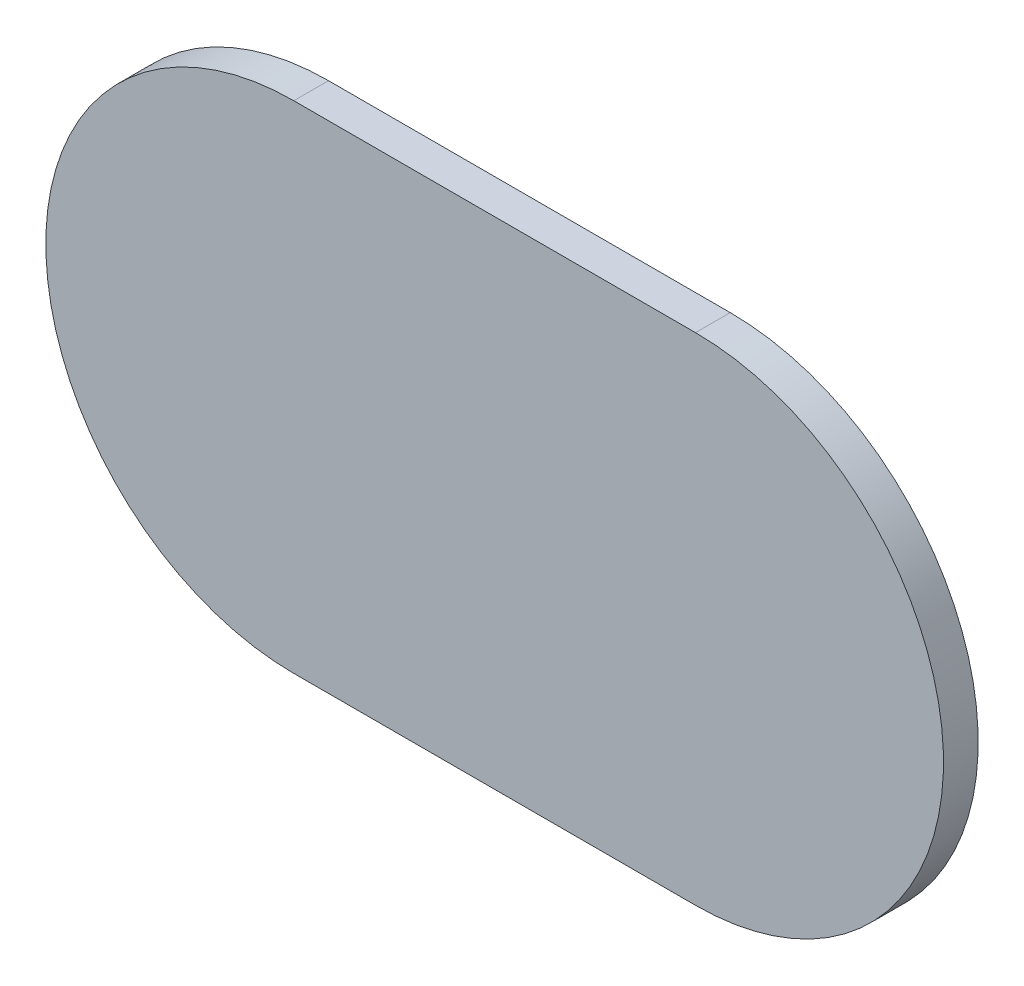
ISO-10303-21;
HEADER;
FILE_DESCRIPTION(('STEP AP214'),'2;1');
FILE_NAME('part.step','',(''),(''),'','','');
FILE_SCHEMA(('AUTOMOTIVE_DESIGN { 1 0 10303 214 1 1 1 1 }'));
ENDSEC;
DATA;
#1=APPLICATION_CONTEXT('core data for automotive mechanical design processes');
#2=APPLICATION_PROTOCOL_DEFINITION('international standard','automotive_design',2000,#1);
#3=PRODUCT_CONTEXT('',#1,'mechanical');
#4=PRODUCT('Part','Part','',(#3));
#5=PRODUCT_RELATED_PRODUCT_CATEGORY('part','',(#4));
#6=PRODUCT_DEFINITION_FORMATION('','',#4);
#7=PRODUCT_DEFINITION_CONTEXT('part definition',#1,'design');
#8=PRODUCT_DEFINITION('design','',#6,#7);
#9=PRODUCT_DEFINITION_SHAPE('','',#8);
#10=(LENGTH_UNIT() NAMED_UNIT(*) SI_UNIT(.MILLI.,.METRE.));
#11=(NAMED_UNIT(*) PLANE_ANGLE_UNIT() SI_UNIT($,.RADIAN.));
#12=(NAMED_UNIT(*) SI_UNIT($,.STERADIAN.) SOLID_ANGLE_UNIT());
#13=UNCERTAINTY_MEASURE_WITH_UNIT(LENGTH_MEASURE(1.E-05),#10,'distance_accuracy_value','');
#14=(GEOMETRIC_REPRESENTATION_CONTEXT(3) GLOBAL_UNCERTAINTY_ASSIGNED_CONTEXT((#13)) GLOBAL_UNIT_ASSIGNED_CONTEXT((#10,
#11,#12)) REPRESENTATION_CONTEXT('',''));
#15=CARTESIAN_POINT('',(0.,0.,0.));
#16=DIRECTION('',(0.,0.,1.));
#17=DIRECTION('',(1.,0.,0.));
#18=AXIS2_PLACEMENT_3D('',#15,#16,#17);
#19=CARTESIAN_POINT('',(78.0225,-111.3675,1.635));
#20=DIRECTION('',(0.,0.,1.));
#21=DIRECTION('',(1.,0.,0.));
#22=AXIS2_PLACEMENT_3D('',#19,#20,#21);
#23=PLANE('',#22);
#24=DIRECTION('',(-1.,0.,0.));
#25=VECTOR('',#24,1.);
#26=CARTESIAN_POINT('',(78.0225,-111.3675,1.635));
#27=LINE('',#26,#25);
#28=CARTESIAN_POINT('',(78.0225,-111.3675,1.635));
#29=VERTEX_POINT('',#28);
#30=CARTESIAN_POINT('',(77.6175,-111.3675,1.635));
#31=VERTEX_POINT('',#30);
#32=EDGE_CURVE('E83',#29,#31,#27,.T.);
#33=ORIENTED_EDGE('',*,*,#32,.T.);
#34=CARTESIAN_POINT('',(77.6175,-111.6175,1.635));
#35=DIRECTION('',(0.,0.,1.));
#36=DIRECTION('',(0.,1.,0.));
#37=AXIS2_PLACEMENT_3D('',#34,#35,#36);
#38=CIRCLE('',#37,0.25);
#39=CARTESIAN_POINT('',(77.6175,-111.8675,1.635));
#40=VERTEX_POINT('',#39);
#41=EDGE_CURVE('E99',#31,#40,#38,.T.);
#42=ORIENTED_EDGE('',*,*,#41,.T.);
#43=DIRECTION('',(1.,0.,0.));
#44=VECTOR('',#43,1.);
#45=CARTESIAN_POINT('',(77.6175,-111.8675,1.635));
#46=LINE('',#45,#44);
#47=CARTESIAN_POINT('',(78.0225,-111.8675,1.635));
#48=VERTEX_POINT('',#47);
#49=EDGE_CURVE('E20',#40,#48,#46,.T.);
#50=ORIENTED_EDGE('',*,*,#49,.T.);
#51=CARTESIAN_POINT('',(78.0225,-111.6175,1.635));
#52=DIRECTION('',(0.,0.,1.));
#53=DIRECTION('',(0.,-1.,0.));
#54=AXIS2_PLACEMENT_3D('',#51,#52,#53);
#55=CIRCLE('',#54,0.25);
#56=EDGE_CURVE('E11',#48,#29,#55,.T.);
#57=ORIENTED_EDGE('',*,*,#56,.T.);
#58=EDGE_LOOP('',(#33,#42,#50,#57));
#59=FACE_BOUND('',#58,.T.);
#60=ADVANCED_FACE('F17',(#59),#23,.T.);
#61=CARTESIAN_POINT('',(78.0225,-111.3675,1.6));
#62=DIRECTION('',(0.,0.,1.));
#63=DIRECTION('',(1.,0.,0.));
#64=AXIS2_PLACEMENT_3D('',#61,#62,#63);
#65=PLANE('',#64);
#66=CARTESIAN_POINT('',(78.0225,-111.6175,1.6));
#67=DIRECTION('',(0.,0.,1.));
#68=DIRECTION('',(0.,-1.,0.));
#69=AXIS2_PLACEMENT_3D('',#66,#67,#68);
#70=CIRCLE('',#69,0.25);
#71=CARTESIAN_POINT('',(78.0225,-111.8675,1.6));
#72=VERTEX_POINT('',#71);
#73=CARTESIAN_POINT('',(78.0225,-111.3675,1.6));
#74=VERTEX_POINT('',#73);
#75=EDGE_CURVE('E26',#72,#74,#70,.T.);
#76=ORIENTED_EDGE('',*,*,#75,.F.);
#77=DIRECTION('',(1.,0.,0.));
#78=VECTOR('',#77,1.);
#79=CARTESIAN_POINT('',(77.6175,-111.8675,1.6));
#80=LINE('',#79,#78);
#81=CARTESIAN_POINT('',(77.6175,-111.8675,1.6));
#82=VERTEX_POINT('',#81);
#83=EDGE_CURVE('E109',#82,#72,#80,.T.);
#84=ORIENTED_EDGE('',*,*,#83,.F.);
#85=CARTESIAN_POINT('',(77.6175,-111.6175,1.6));
#86=DIRECTION('',(0.,0.,1.));
#87=DIRECTION('',(0.,1.,0.));
#88=AXIS2_PLACEMENT_3D('',#85,#86,#87);
#89=CIRCLE('',#88,0.25);
#90=CARTESIAN_POINT('',(77.6175,-111.3675,1.6));
#91=VERTEX_POINT('',#90);
#92=EDGE_CURVE('E85',#91,#82,#89,.T.);
#93=ORIENTED_EDGE('',*,*,#92,.F.);
#94=DIRECTION('',(-1.,0.,0.));
#95=VECTOR('',#94,1.);
#96=CARTESIAN_POINT('',(78.0225,-111.3675,1.6));
#97=LINE('',#96,#95);
#98=EDGE_CURVE('E81',#74,#91,#97,.T.);
#99=ORIENTED_EDGE('',*,*,#98,.F.);
#100=EDGE_LOOP('',(#76,#84,#93,#99));
#101=FACE_BOUND('',#100,.T.);
#102=ADVANCED_FACE('F87',(#101),#65,.F.);
#103=CARTESIAN_POINT('',(78.0225,-111.6175,1.6));
#104=DIRECTION('',(0.,0.,-1.));
#105=DIRECTION('',(0.,-1.,0.));
#106=AXIS2_PLACEMENT_3D('',#103,#104,#105);
#107=CYLINDRICAL_SURFACE('',#106,0.25);
#108=ORIENTED_EDGE('',*,*,#75,.T.);
#109=DIRECTION('',(0.,0.,1.));
#110=VECTOR('',#109,1.);
#111=CARTESIAN_POINT('',(78.0225,-111.3675,1.6));
#112=LINE('',#111,#110);
#113=EDGE_CURVE('E70',#74,#29,#112,.T.);
#114=ORIENTED_EDGE('',*,*,#113,.T.);
#115=ORIENTED_EDGE('',*,*,#56,.F.);
#116=DIRECTION('',(0.,0.,1.));
#117=VECTOR('',#116,1.);
#118=CARTESIAN_POINT('',(78.0225,-111.8675,1.6));
#119=LINE('',#118,#117);
#120=EDGE_CURVE('E73',#72,#48,#119,.T.);
#121=ORIENTED_EDGE('',*,*,#120,.F.);
#122=EDGE_LOOP('',(#108,#114,#115,#121));
#123=FACE_BOUND('',#122,.T.);
#124=ADVANCED_FACE('F69',(#123),#107,.T.);
#125=CARTESIAN_POINT('',(77.6175,-111.8675,1.6));
#126=DIRECTION('',(0.,1.,0.));
#127=DIRECTION('',(1.,0.,0.));
#128=AXIS2_PLACEMENT_3D('',#125,#126,#127);
#129=PLANE('',#128);
#130=ORIENTED_EDGE('',*,*,#83,.T.);
#131=ORIENTED_EDGE('',*,*,#120,.T.);
#132=ORIENTED_EDGE('',*,*,#49,.F.);
#133=DIRECTION('',(0.,0.,1.));
#134=VECTOR('',#133,1.);
#135=CARTESIAN_POINT('',(77.6175,-111.8675,1.6));
#136=LINE('',#135,#134);
#137=EDGE_CURVE('E105',#82,#40,#136,.T.);
#138=ORIENTED_EDGE('',*,*,#137,.F.);
#139=EDGE_LOOP('',(#130,#131,#132,#138));
#140=FACE_BOUND('',#139,.T.);
#141=ADVANCED_FACE('F121',(#140),#129,.F.);
#142=CARTESIAN_POINT('',(77.6175,-111.6175,1.6));
#143=DIRECTION('',(0.,0.,-1.));
#144=DIRECTION('',(0.,1.,0.));
#145=AXIS2_PLACEMENT_3D('',#142,#143,#144);
#146=CYLINDRICAL_SURFACE('',#145,0.25);
#147=ORIENTED_EDGE('',*,*,#92,.T.);
#148=ORIENTED_EDGE('',*,*,#137,.T.);
#149=ORIENTED_EDGE('',*,*,#41,.F.);
#150=DIRECTION('',(0.,0.,1.));
#151=VECTOR('',#150,1.);
#152=CARTESIAN_POINT('',(77.6175,-111.3675,1.6));
#153=LINE('',#152,#151);
#154=EDGE_CURVE('E91',#91,#31,#153,.T.);
#155=ORIENTED_EDGE('',*,*,#154,.F.);
#156=EDGE_LOOP('',(#147,#148,#149,#155));
#157=FACE_BOUND('',#156,.T.);
#158=ADVANCED_FACE('F123',(#157),#146,.T.);
#159=CARTESIAN_POINT('',(78.0225,-111.3675,1.6));
#160=DIRECTION('',(0.,-1.,0.));
#161=DIRECTION('',(0.,0.,-1.));
#162=AXIS2_PLACEMENT_3D('',#159,#160,#161);
#163=PLANE('',#162);
#164=ORIENTED_EDGE('',*,*,#98,.T.);
#165=ORIENTED_EDGE('',*,*,#154,.T.);
#166=ORIENTED_EDGE('',*,*,#32,.F.);
#167=ORIENTED_EDGE('',*,*,#113,.F.);
#168=EDGE_LOOP('',(#164,#165,#166,#167));
#169=FACE_BOUND('',#168,.T.);
#170=ADVANCED_FACE('F79',(#169),#163,.F.);
#171=CLOSED_SHELL('',(#60,#102,#124,#141,#158,#170));
#172=MANIFOLD_SOLID_BREP('B1',#171);
#173=ADVANCED_BREP_SHAPE_REPRESENTATION('',(#18,#172),#14);
#174=SHAPE_DEFINITION_REPRESENTATION(#9,#173);
ENDSEC;
END-ISO-10303-21;
